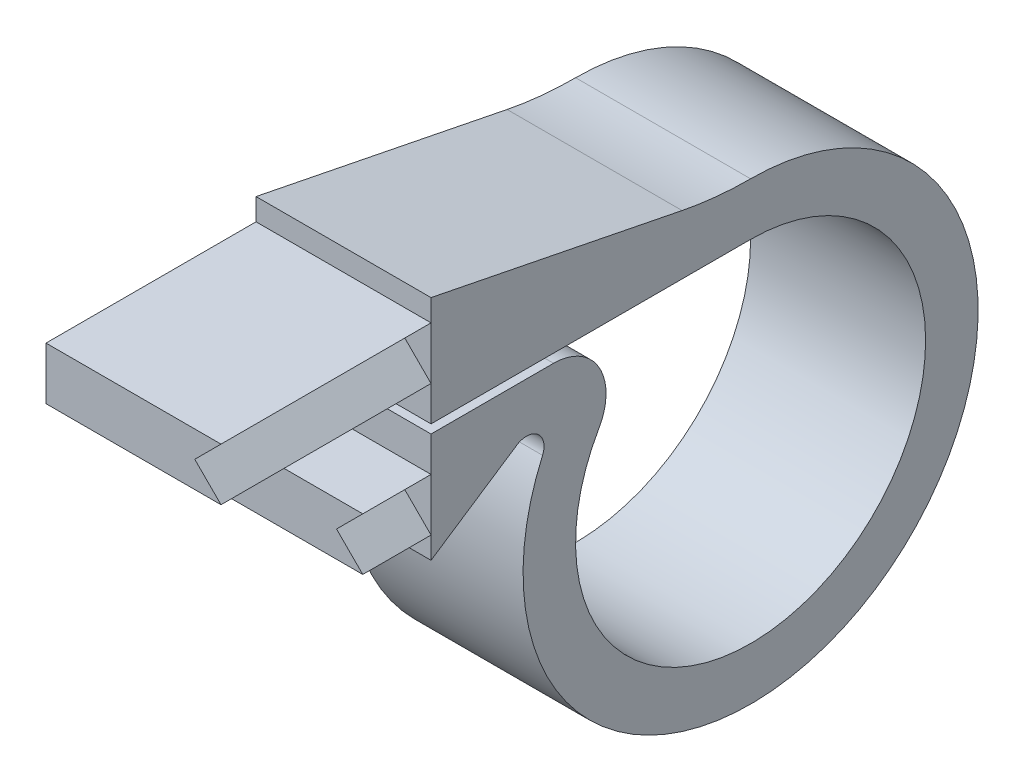
ISO-10303-21;
HEADER;
FILE_DESCRIPTION(('STEP AP214'),'2;1');
FILE_NAME('part.step','',(''),(''),'','','');
FILE_SCHEMA(('AUTOMOTIVE_DESIGN { 1 0 10303 214 1 1 1 1 }'));
ENDSEC;
DATA;
#1=APPLICATION_CONTEXT('core data for automotive mechanical design processes');
#2=APPLICATION_PROTOCOL_DEFINITION('international standard','automotive_design',2000,#1);
#3=PRODUCT_CONTEXT('',#1,'mechanical');
#4=PRODUCT('Part','Part','',(#3));
#5=PRODUCT_RELATED_PRODUCT_CATEGORY('part','',(#4));
#6=PRODUCT_DEFINITION_FORMATION('','',#4);
#7=PRODUCT_DEFINITION_CONTEXT('part definition',#1,'design');
#8=PRODUCT_DEFINITION('design','',#6,#7);
#9=PRODUCT_DEFINITION_SHAPE('','',#8);
#10=(LENGTH_UNIT() NAMED_UNIT(*) SI_UNIT(.MILLI.,.METRE.));
#11=(NAMED_UNIT(*) PLANE_ANGLE_UNIT() SI_UNIT($,.RADIAN.));
#12=(NAMED_UNIT(*) SI_UNIT($,.STERADIAN.) SOLID_ANGLE_UNIT());
#13=UNCERTAINTY_MEASURE_WITH_UNIT(LENGTH_MEASURE(1.E-05),#10,'distance_accuracy_value','');
#14=(GEOMETRIC_REPRESENTATION_CONTEXT(3) GLOBAL_UNCERTAINTY_ASSIGNED_CONTEXT((#13)) GLOBAL_UNIT_ASSIGNED_CONTEXT((#10,
#11,#12)) REPRESENTATION_CONTEXT('',''));
#15=CARTESIAN_POINT('',(0.,0.,0.));
#16=DIRECTION('',(0.,0.,1.));
#17=DIRECTION('',(1.,0.,0.));
#18=AXIS2_PLACEMENT_3D('',#15,#16,#17);
#19=CARTESIAN_POINT('',(0.,-10.,0.));
#20=DIRECTION('',(-1.,0.,0.));
#21=DIRECTION('',(0.,0.,1.));
#22=AXIS2_PLACEMENT_3D('',#19,#20,#21);
#23=PLANE('',#22);
#24=DIRECTION('',(0.,0.,-1.));
#25=VECTOR('',#24,1.);
#26=CARTESIAN_POINT('',(0.,-5.5,30.2583302491977));
#27=LINE('',#26,#25);
#28=CARTESIAN_POINT('',(0.,-5.5,22.1583302491977));
#29=VERTEX_POINT('',#28);
#30=CARTESIAN_POINT('',(0.,-5.5,18.2583302491977));
#31=VERTEX_POINT('',#30);
#32=EDGE_CURVE('E189',#29,#31,#27,.T.);
#33=ORIENTED_EDGE('',*,*,#32,.F.);
#34=DIRECTION('',(0.,1.,0.));
#35=VECTOR('',#34,1.);
#36=CARTESIAN_POINT('',(0.,0.,22.1583302491977));
#37=LINE('',#36,#35);
#38=CARTESIAN_POINT('',(0.,-2.5,22.1583302491977));
#39=VERTEX_POINT('',#38);
#40=EDGE_CURVE('E175',#29,#39,#37,.T.);
#41=ORIENTED_EDGE('',*,*,#40,.T.);
#42=DIRECTION('',(0.,0.,-1.));
#43=VECTOR('',#42,1.);
#44=CARTESIAN_POINT('',(0.,-2.5,30.2583302491977));
#45=LINE('',#44,#43);
#46=CARTESIAN_POINT('',(0.,-2.5,18.2583302491977));
#47=VERTEX_POINT('',#46);
#48=EDGE_CURVE('E328',#39,#47,#45,.T.);
#49=ORIENTED_EDGE('',*,*,#48,.T.);
#50=DIRECTION('',(0.,-1.,0.));
#51=VECTOR('',#50,1.);
#52=CARTESIAN_POINT('',(0.,-6.75,18.2583302491977));
#53=LINE('',#52,#51);
#54=CARTESIAN_POINT('',(0.,-0.5,18.2583302491977));
#55=VERTEX_POINT('',#54);
#56=EDGE_CURVE('E276',#55,#47,#53,.T.);
#57=ORIENTED_EDGE('',*,*,#56,.F.);
#58=DIRECTION('',(0.,0.,1.));
#59=VECTOR('',#58,1.);
#60=CARTESIAN_POINT('',(0.,-0.5,11.2583302491977));
#61=LINE('',#60,#59);
#62=CARTESIAN_POINT('',(0.,-0.5,11.2583302491977));
#63=VERTEX_POINT('',#62);
#64=EDGE_CURVE('E274',#63,#55,#61,.T.);
#65=ORIENTED_EDGE('',*,*,#64,.F.);
#66=CARTESIAN_POINT('',(0.,-3.5,11.2583302491977));
#67=DIRECTION('',(1.,0.,0.));
#68=DIRECTION('',(0.,0.,-1.));
#69=AXIS2_PLACEMENT_3D('',#66,#67,#68);
#70=CIRCLE('',#69,3.);
#71=CARTESIAN_POINT('',(0.,-5.,8.66025403784439));
#72=VERTEX_POINT('',#71);
#73=EDGE_CURVE('E272',#72,#63,#70,.T.);
#74=ORIENTED_EDGE('',*,*,#73,.F.);
#75=CARTESIAN_POINT('',(0.,-10.,0.));
#76=DIRECTION('',(-1.,0.,0.));
#77=DIRECTION('',(0.,0.,1.));
#78=AXIS2_PLACEMENT_3D('',#75,#76,#77);
#79=CIRCLE('',#78,10.);
#80=CARTESIAN_POINT('',(0.,0.,0.));
#81=VERTEX_POINT('',#80);
#82=EDGE_CURVE('E238',#81,#72,#79,.T.);
#83=ORIENTED_EDGE('',*,*,#82,.F.);
#84=DIRECTION('',(0.,0.,-1.));
#85=VECTOR('',#84,1.);
#86=CARTESIAN_POINT('',(0.,0.,0.));
#87=LINE('',#86,#85);
#88=CARTESIAN_POINT('',(0.,0.,18.2583302491977));
#89=VERTEX_POINT('',#88);
#90=EDGE_CURVE('E243',#89,#81,#87,.T.);
#91=ORIENTED_EDGE('',*,*,#90,.F.);
#92=DIRECTION('',(0.,-1.,0.));
#93=VECTOR('',#92,1.);
#94=CARTESIAN_POINT('',(0.,6.25,18.2583302491977));
#95=LINE('',#94,#93);
#96=CARTESIAN_POINT('',(0.,2.,18.2583302491977));
#97=VERTEX_POINT('',#96);
#98=EDGE_CURVE('E289',#97,#89,#95,.T.);
#99=ORIENTED_EDGE('',*,*,#98,.F.);
#100=DIRECTION('',(0.,0.,-1.));
#101=VECTOR('',#100,1.);
#102=CARTESIAN_POINT('',(0.,2.,30.2583302491977));
#103=LINE('',#102,#101);
#104=CARTESIAN_POINT('',(0.,2.,30.2583302491977));
#105=VERTEX_POINT('',#104);
#106=EDGE_CURVE('E235',#105,#97,#103,.T.);
#107=ORIENTED_EDGE('',*,*,#106,.F.);
#108=DIRECTION('',(0.,-1.,0.));
#109=VECTOR('',#108,1.);
#110=CARTESIAN_POINT('',(0.,5.,30.2583302491977));
#111=LINE('',#110,#109);
#112=CARTESIAN_POINT('',(0.,5.,30.2583302491977));
#113=VERTEX_POINT('',#112);
#114=EDGE_CURVE('E204',#113,#105,#111,.T.);
#115=ORIENTED_EDGE('',*,*,#114,.F.);
#116=DIRECTION('',(0.,0.,-1.));
#117=VECTOR('',#116,1.);
#118=CARTESIAN_POINT('',(0.,5.,30.2583302491977));
#119=LINE('',#118,#117);
#120=CARTESIAN_POINT('',(0.,5.,18.2583302491977));
#121=VERTEX_POINT('',#120);
#122=EDGE_CURVE('E215',#113,#121,#119,.T.);
#123=ORIENTED_EDGE('',*,*,#122,.T.);
#124=CARTESIAN_POINT('',(0.,6.25,18.2583302491977));
#125=VERTEX_POINT('',#124);
#126=EDGE_CURVE('E290',#125,#121,#95,.T.);
#127=ORIENTED_EDGE('',*,*,#126,.F.);
#128=DIRECTION('',(0.,0.195748670709465,0.980654096975828));
#129=VECTOR('',#128,1.);
#130=CARTESIAN_POINT('',(0.,3.38691806048344,3.91497341418931));
#131=LINE('',#130,#129);
#132=CARTESIAN_POINT('',(0.,3.38691806048344,3.91497341418931));
#133=VERTEX_POINT('',#132);
#134=EDGE_CURVE('E287',#133,#125,#131,.T.);
#135=ORIENTED_EDGE('',*,*,#134,.F.);
#136=CARTESIAN_POINT('',(0.,23.,0.));
#137=DIRECTION('',(-1.,0.,0.));
#138=DIRECTION('',(0.,0.,1.));
#139=AXIS2_PLACEMENT_3D('',#136,#137,#138);
#140=CIRCLE('',#139,20.);
#141=CARTESIAN_POINT('',(0.,3.,0.));
#142=VERTEX_POINT('',#141);
#143=EDGE_CURVE('E285',#142,#133,#140,.T.);
#144=ORIENTED_EDGE('',*,*,#143,.F.);
#145=CARTESIAN_POINT('',(0.,-10.,0.));
#146=DIRECTION('',(1.,0.,0.));
#147=DIRECTION('',(0.,0.,1.));
#148=AXIS2_PLACEMENT_3D('',#145,#146,#147);
#149=CIRCLE('',#148,13.);
#150=CARTESIAN_POINT('',(0.,-4.73830400663237,11.887579874532));
#151=VERTEX_POINT('',#150);
#152=EDGE_CURVE('E283',#151,#142,#149,.T.);
#153=ORIENTED_EDGE('',*,*,#152,.F.);
#154=CARTESIAN_POINT('',(0.,-4.33355816098871,12.8020090956499));
#155=DIRECTION('',(-1.,0.,0.));
#156=DIRECTION('',(0.,0.,-1.));
#157=AXIS2_PLACEMENT_3D('',#154,#155,#156);
#158=CIRCLE('',#157,0.999999999999999);
#159=CARTESIAN_POINT('',(0.,-3.5,13.3544408038719));
#160=VERTEX_POINT('',#159);
#161=EDGE_CURVE('E281',#160,#151,#158,.T.);
#162=ORIENTED_EDGE('',*,*,#161,.F.);
#163=DIRECTION('',(0.,0.552431708222033,-0.833558160988714));
#164=VECTOR('',#163,1.);
#165=CARTESIAN_POINT('',(0.,-6.75,18.2583302491977));
#166=LINE('',#165,#164);
#167=CARTESIAN_POINT('',(0.,-6.75,18.2583302491977));
#168=VERTEX_POINT('',#167);
#169=EDGE_CURVE('E279',#168,#160,#166,.T.);
#170=ORIENTED_EDGE('',*,*,#169,.F.);
#171=EDGE_CURVE('E194',#31,#168,#53,.T.);
#172=ORIENTED_EDGE('',*,*,#171,.F.);
#173=EDGE_LOOP('',(#33,#41,#49,#57,#65,#74,#83,#91,#99,#107,#115,#123,#127,#135,#144,#153,#162,
#170,#172));
#174=FACE_BOUND('',#173,.T.);
#175=ADVANCED_FACE('F33',(#174),#23,.T.);
#176=CARTESIAN_POINT('',(0.,-5.5,30.2583302491977));
#177=DIRECTION('',(0.,1.,0.));
#178=DIRECTION('',(-1.,0.,0.));
#179=AXIS2_PLACEMENT_3D('',#176,#177,#178);
#180=PLANE('',#179);
#181=DIRECTION('',(-1.,0.,0.));
#182=VECTOR('',#181,1.);
#183=CARTESIAN_POINT('',(12.,-5.5,22.1583302491977));
#184=LINE('',#183,#182);
#185=CARTESIAN_POINT('',(10.,-5.5,22.1583302491977));
#186=VERTEX_POINT('',#185);
#187=EDGE_CURVE('E178',#186,#29,#184,.T.);
#188=ORIENTED_EDGE('',*,*,#187,.T.);
#189=ORIENTED_EDGE('',*,*,#32,.T.);
#190=DIRECTION('',(1.,0.,0.));
#191=VECTOR('',#190,1.);
#192=CARTESIAN_POINT('',(0.,-5.5,18.2583302491977));
#193=LINE('',#192,#191);
#194=CARTESIAN_POINT('',(10.,-5.5,18.2583302491977));
#195=VERTEX_POINT('',#194);
#196=EDGE_CURVE('E349',#31,#195,#193,.T.);
#197=ORIENTED_EDGE('',*,*,#196,.T.);
#198=DIRECTION('',(0.,0.,-1.));
#199=VECTOR('',#198,1.);
#200=CARTESIAN_POINT('',(10.,-5.5,30.2583302491977));
#201=LINE('',#200,#199);
#202=EDGE_CURVE('E191',#186,#195,#201,.T.);
#203=ORIENTED_EDGE('',*,*,#202,.F.);
#204=EDGE_LOOP('',(#188,#189,#197,#203));
#205=FACE_BOUND('',#204,.T.);
#206=ADVANCED_FACE('F187',(#205),#180,.F.);
#207=CARTESIAN_POINT('',(8.5,-4.,30.2583302491977));
#208=DIRECTION('',(-0.707106781186548,-0.707106781186547,0.));
#209=DIRECTION('',(0.707106781186547,-0.707106781186548,0.));
#210=AXIS2_PLACEMENT_3D('',#207,#208,#209);
#211=PLANE('',#210);
#212=DIRECTION('',(-0.707106781186547,0.707106781186548,0.));
#213=VECTOR('',#212,1.);
#214=CARTESIAN_POINT('',(8.5,-4.,22.1583302491977));
#215=LINE('',#214,#213);
#216=CARTESIAN_POINT('',(8.5,-4.,22.1583302491977));
#217=VERTEX_POINT('',#216);
#218=EDGE_CURVE('E351',#186,#217,#215,.T.);
#219=ORIENTED_EDGE('',*,*,#218,.F.);
#220=ORIENTED_EDGE('',*,*,#202,.T.);
#221=DIRECTION('',(-0.707106781186547,0.707106781186548,0.));
#222=VECTOR('',#221,1.);
#223=CARTESIAN_POINT('',(8.5,-4.,18.2583302491977));
#224=LINE('',#223,#222);
#225=CARTESIAN_POINT('',(8.5,-4.,18.2583302491977));
#226=VERTEX_POINT('',#225);
#227=EDGE_CURVE('E343',#195,#226,#224,.T.);
#228=ORIENTED_EDGE('',*,*,#227,.T.);
#229=DIRECTION('',(0.,0.,-1.));
#230=VECTOR('',#229,1.);
#231=CARTESIAN_POINT('',(8.5,-4.,30.2583302491977));
#232=LINE('',#231,#230);
#233=EDGE_CURVE('E55',#217,#226,#232,.T.);
#234=ORIENTED_EDGE('',*,*,#233,.F.);
#235=EDGE_LOOP('',(#219,#220,#228,#234));
#236=FACE_BOUND('',#235,.T.);
#237=ADVANCED_FACE('F356',(#236),#211,.F.);
#238=CARTESIAN_POINT('',(10.,-2.5,30.2583302491977));
#239=DIRECTION('',(-0.707106781186548,0.707106781186547,0.));
#240=DIRECTION('',(-0.707106781186547,-0.707106781186548,0.));
#241=AXIS2_PLACEMENT_3D('',#238,#239,#240);
#242=PLANE('',#241);
#243=DIRECTION('',(0.707106781186547,0.707106781186548,0.));
#244=VECTOR('',#243,1.);
#245=CARTESIAN_POINT('',(10.,-2.5,22.1583302491977));
#246=LINE('',#245,#244);
#247=CARTESIAN_POINT('',(10.,-2.5,22.1583302491977));
#248=VERTEX_POINT('',#247);
#249=EDGE_CURVE('E48',#217,#248,#246,.T.);
#250=ORIENTED_EDGE('',*,*,#249,.F.);
#251=ORIENTED_EDGE('',*,*,#233,.T.);
#252=DIRECTION('',(0.707106781186547,0.707106781186548,0.));
#253=VECTOR('',#252,1.);
#254=CARTESIAN_POINT('',(10.,-2.5,18.2583302491977));
#255=LINE('',#254,#253);
#256=CARTESIAN_POINT('',(10.,-2.5,18.2583302491977));
#257=VERTEX_POINT('',#256);
#258=EDGE_CURVE('E340',#226,#257,#255,.T.);
#259=ORIENTED_EDGE('',*,*,#258,.T.);
#260=DIRECTION('',(0.,0.,-1.));
#261=VECTOR('',#260,1.);
#262=CARTESIAN_POINT('',(10.,-2.5,30.2583302491977));
#263=LINE('',#262,#261);
#264=EDGE_CURVE('E339',#248,#257,#263,.T.);
#265=ORIENTED_EDGE('',*,*,#264,.F.);
#266=EDGE_LOOP('',(#250,#251,#259,#265));
#267=FACE_BOUND('',#266,.T.);
#268=ADVANCED_FACE('F355',(#267),#242,.F.);
#269=CARTESIAN_POINT('',(10.,-2.5,30.2583302491977));
#270=DIRECTION('',(0.,-1.,0.));
#271=DIRECTION('',(0.,0.,-1.));
#272=AXIS2_PLACEMENT_3D('',#269,#270,#271);
#273=PLANE('',#272);
#274=DIRECTION('',(-1.,0.,0.));
#275=VECTOR('',#274,1.);
#276=CARTESIAN_POINT('',(12.,-2.5,22.1583302491977));
#277=LINE('',#276,#275);
#278=EDGE_CURVE('E180',#248,#39,#277,.T.);
#279=ORIENTED_EDGE('',*,*,#278,.F.);
#280=ORIENTED_EDGE('',*,*,#264,.T.);
#281=DIRECTION('',(-1.,0.,0.));
#282=VECTOR('',#281,1.);
#283=CARTESIAN_POINT('',(10.,-2.5,18.2583302491977));
#284=LINE('',#283,#282);
#285=EDGE_CURVE('E334',#257,#47,#284,.T.);
#286=ORIENTED_EDGE('',*,*,#285,.T.);
#287=ORIENTED_EDGE('',*,*,#48,.F.);
#288=EDGE_LOOP('',(#279,#280,#286,#287));
#289=FACE_BOUND('',#288,.T.);
#290=ADVANCED_FACE('F337',(#289),#273,.F.);
#291=CARTESIAN_POINT('',(10.,-6.75,18.2583302491977));
#292=DIRECTION('',(0.,0.,-1.));
#293=DIRECTION('',(-1.,0.,0.));
#294=AXIS2_PLACEMENT_3D('',#291,#292,#293);
#295=PLANE('',#294);
#296=ORIENTED_EDGE('',*,*,#196,.F.);
#297=ORIENTED_EDGE('',*,*,#171,.T.);
#298=DIRECTION('',(-1.,0.,0.));
#299=VECTOR('',#298,1.);
#300=CARTESIAN_POINT('',(10.,-6.75,18.2583302491977));
#301=LINE('',#300,#299);
#302=CARTESIAN_POINT('',(10.,-6.75,18.2583302491977));
#303=VERTEX_POINT('',#302);
#304=EDGE_CURVE('E313',#303,#168,#301,.T.);
#305=ORIENTED_EDGE('',*,*,#304,.F.);
#306=DIRECTION('',(0.,-1.,0.));
#307=VECTOR('',#306,1.);
#308=CARTESIAN_POINT('',(10.,-6.75,18.2583302491977));
#309=LINE('',#308,#307);
#310=EDGE_CURVE('E247',#195,#303,#309,.T.);
#311=ORIENTED_EDGE('',*,*,#310,.F.);
#312=EDGE_LOOP('',(#296,#297,#305,#311));
#313=FACE_BOUND('',#312,.T.);
#314=ADVANCED_FACE('F364',(#313),#295,.F.);
#315=ORIENTED_EDGE('',*,*,#227,.F.);
#316=EDGE_CURVE('E252',#257,#195,#309,.T.);
#317=ORIENTED_EDGE('',*,*,#316,.F.);
#318=ORIENTED_EDGE('',*,*,#258,.F.);
#319=EDGE_LOOP('',(#315,#317,#318));
#320=FACE_BOUND('',#319,.T.);
#321=ADVANCED_FACE('F360',(#320),#295,.F.);
#322=ORIENTED_EDGE('',*,*,#285,.F.);
#323=CARTESIAN_POINT('',(10.,-0.5,18.2583302491977));
#324=VERTEX_POINT('',#323);
#325=EDGE_CURVE('E248',#324,#257,#309,.T.);
#326=ORIENTED_EDGE('',*,*,#325,.F.);
#327=DIRECTION('',(-1.,0.,0.));
#328=VECTOR('',#327,1.);
#329=CARTESIAN_POINT('',(10.,-0.5,18.2583302491977));
#330=LINE('',#329,#328);
#331=EDGE_CURVE('E316',#324,#55,#330,.T.);
#332=ORIENTED_EDGE('',*,*,#331,.T.);
#333=ORIENTED_EDGE('',*,*,#56,.T.);
#334=EDGE_LOOP('',(#322,#326,#332,#333));
#335=FACE_BOUND('',#334,.T.);
#336=ADVANCED_FACE('F332',(#335),#295,.F.);
#337=CARTESIAN_POINT('',(10.,6.25,18.2583302491977));
#338=DIRECTION('',(0.,0.,-1.));
#339=DIRECTION('',(0.,1.,0.));
#340=AXIS2_PLACEMENT_3D('',#337,#338,#339);
#341=PLANE('',#340);
#342=DIRECTION('',(1.,0.,0.));
#343=VECTOR('',#342,1.);
#344=CARTESIAN_POINT('',(0.,2.,18.2583302491977));
#345=LINE('',#344,#343);
#346=CARTESIAN_POINT('',(10.,2.,18.2583302491977));
#347=VERTEX_POINT('',#346);
#348=EDGE_CURVE('E196',#97,#347,#345,.T.);
#349=ORIENTED_EDGE('',*,*,#348,.F.);
#350=ORIENTED_EDGE('',*,*,#98,.T.);
#351=DIRECTION('',(-1.,0.,0.));
#352=VECTOR('',#351,1.);
#353=CARTESIAN_POINT('',(10.,0.,18.2583302491977));
#354=LINE('',#353,#352);
#355=CARTESIAN_POINT('',(10.,0.,18.2583302491977));
#356=VERTEX_POINT('',#355);
#357=EDGE_CURVE('E295',#356,#89,#354,.T.);
#358=ORIENTED_EDGE('',*,*,#357,.F.);
#359=DIRECTION('',(0.,-1.,0.));
#360=VECTOR('',#359,1.);
#361=CARTESIAN_POINT('',(10.,6.25,18.2583302491977));
#362=LINE('',#361,#360);
#363=EDGE_CURVE('E262',#347,#356,#362,.T.);
#364=ORIENTED_EDGE('',*,*,#363,.F.);
#365=EDGE_LOOP('',(#349,#350,#358,#364));
#366=FACE_BOUND('',#365,.T.);
#367=ADVANCED_FACE('F382',(#366),#341,.F.);
#368=DIRECTION('',(-0.707106781186547,0.707106781186548,0.));
#369=VECTOR('',#368,1.);
#370=CARTESIAN_POINT('',(8.5,3.5,18.2583302491977));
#371=LINE('',#370,#369);
#372=CARTESIAN_POINT('',(8.5,3.5,18.2583302491977));
#373=VERTEX_POINT('',#372);
#374=EDGE_CURVE('E199',#347,#373,#371,.T.);
#375=ORIENTED_EDGE('',*,*,#374,.F.);
#376=CARTESIAN_POINT('',(10.,5.,18.2583302491977));
#377=VERTEX_POINT('',#376);
#378=EDGE_CURVE('E267',#377,#347,#362,.T.);
#379=ORIENTED_EDGE('',*,*,#378,.F.);
#380=DIRECTION('',(0.707106781186548,0.707106781186547,0.));
#381=VECTOR('',#380,1.);
#382=CARTESIAN_POINT('',(10.,5.,18.2583302491977));
#383=LINE('',#382,#381);
#384=EDGE_CURVE('E219',#373,#377,#383,.T.);
#385=ORIENTED_EDGE('',*,*,#384,.F.);
#386=EDGE_LOOP('',(#375,#379,#385));
#387=FACE_BOUND('',#386,.T.);
#388=ADVANCED_FACE('F402',(#387),#341,.F.);
#389=DIRECTION('',(-1.,0.,0.));
#390=VECTOR('',#389,1.);
#391=CARTESIAN_POINT('',(10.,5.,18.2583302491977));
#392=LINE('',#391,#390);
#393=EDGE_CURVE('E208',#377,#121,#392,.T.);
#394=ORIENTED_EDGE('',*,*,#393,.F.);
#395=CARTESIAN_POINT('',(10.,6.25,18.2583302491977));
#396=VERTEX_POINT('',#395);
#397=EDGE_CURVE('E263',#396,#377,#362,.T.);
#398=ORIENTED_EDGE('',*,*,#397,.F.);
#399=DIRECTION('',(-1.,0.,0.));
#400=VECTOR('',#399,1.);
#401=CARTESIAN_POINT('',(10.,6.25,18.2583302491977));
#402=LINE('',#401,#400);
#403=EDGE_CURVE('E298',#396,#125,#402,.T.);
#404=ORIENTED_EDGE('',*,*,#403,.T.);
#405=ORIENTED_EDGE('',*,*,#126,.T.);
#406=EDGE_LOOP('',(#394,#398,#404,#405));
#407=FACE_BOUND('',#406,.T.);
#408=ADVANCED_FACE('F400',(#407),#341,.F.);
#409=CARTESIAN_POINT('',(10.,-10.,0.));
#410=DIRECTION('',(-1.,0.,0.));
#411=DIRECTION('',(0.,0.,1.));
#412=AXIS2_PLACEMENT_3D('',#409,#410,#411);
#413=CYLINDRICAL_SURFACE('',#412,10.);
#414=ORIENTED_EDGE('',*,*,#82,.T.);
#415=DIRECTION('',(-1.,0.,0.));
#416=VECTOR('',#415,1.);
#417=CARTESIAN_POINT('',(10.,-5.,8.66025403784439));
#418=LINE('',#417,#416);
#419=CARTESIAN_POINT('',(10.,-5.,8.66025403784439));
#420=VERTEX_POINT('',#419);
#421=EDGE_CURVE('E11',#420,#72,#418,.T.);
#422=ORIENTED_EDGE('',*,*,#421,.F.);
#423=CARTESIAN_POINT('',(10.,-10.,0.));
#424=DIRECTION('',(-1.,0.,0.));
#425=DIRECTION('',(0.,0.,1.));
#426=AXIS2_PLACEMENT_3D('',#423,#424,#425);
#427=CIRCLE('',#426,10.);
#428=CARTESIAN_POINT('',(10.,0.,0.));
#429=VERTEX_POINT('',#428);
#430=EDGE_CURVE('E239',#429,#420,#427,.T.);
#431=ORIENTED_EDGE('',*,*,#430,.F.);
#432=DIRECTION('',(-1.,0.,0.));
#433=VECTOR('',#432,1.);
#434=CARTESIAN_POINT('',(10.,0.,0.));
#435=LINE('',#434,#433);
#436=EDGE_CURVE('E269',#429,#81,#435,.T.);
#437=ORIENTED_EDGE('',*,*,#436,.T.);
#438=EDGE_LOOP('',(#414,#422,#431,#437));
#439=FACE_BOUND('',#438,.T.);
#440=ADVANCED_FACE('F35',(#439),#413,.F.);
#441=CARTESIAN_POINT('',(10.,-3.5,11.2583302491977));
#442=DIRECTION('',(-1.,0.,0.));
#443=DIRECTION('',(0.,0.,1.));
#444=AXIS2_PLACEMENT_3D('',#441,#442,#443);
#445=CYLINDRICAL_SURFACE('',#444,3.);
#446=ORIENTED_EDGE('',*,*,#73,.T.);
#447=DIRECTION('',(-1.,0.,0.));
#448=VECTOR('',#447,1.);
#449=CARTESIAN_POINT('',(10.,-0.5,11.2583302491977));
#450=LINE('',#449,#448);
#451=CARTESIAN_POINT('',(10.,-0.5,11.2583302491977));
#452=VERTEX_POINT('',#451);
#453=EDGE_CURVE('E41',#452,#63,#450,.T.);
#454=ORIENTED_EDGE('',*,*,#453,.F.);
#455=CARTESIAN_POINT('',(10.,-3.5,11.2583302491977));
#456=DIRECTION('',(1.,0.,0.));
#457=DIRECTION('',(0.,0.,-1.));
#458=AXIS2_PLACEMENT_3D('',#455,#456,#457);
#459=CIRCLE('',#458,3.);
#460=EDGE_CURVE('E242',#420,#452,#459,.T.);
#461=ORIENTED_EDGE('',*,*,#460,.F.);
#462=ORIENTED_EDGE('',*,*,#421,.T.);
#463=EDGE_LOOP('',(#446,#454,#461,#462));
#464=FACE_BOUND('',#463,.T.);
#465=ADVANCED_FACE('F370',(#464),#445,.T.);
#466=CARTESIAN_POINT('',(10.,-0.5,11.2583302491977));
#467=DIRECTION('',(0.,-1.,0.));
#468=DIRECTION('',(0.,0.,-1.));
#469=AXIS2_PLACEMENT_3D('',#466,#467,#468);
#470=PLANE('',#469);
#471=ORIENTED_EDGE('',*,*,#64,.T.);
#472=ORIENTED_EDGE('',*,*,#331,.F.);
#473=DIRECTION('',(0.,0.,1.));
#474=VECTOR('',#473,1.);
#475=CARTESIAN_POINT('',(10.,-0.5,11.2583302491977));
#476=LINE('',#475,#474);
#477=EDGE_CURVE('E245',#452,#324,#476,.T.);
#478=ORIENTED_EDGE('',*,*,#477,.F.);
#479=ORIENTED_EDGE('',*,*,#453,.T.);
#480=EDGE_LOOP('',(#471,#472,#478,#479));
#481=FACE_BOUND('',#480,.T.);
#482=ADVANCED_FACE('F323',(#481),#470,.F.);
#483=CARTESIAN_POINT('',(10.,-6.75,18.2583302491977));
#484=DIRECTION('',(0.,0.833558160988714,0.552431708222033));
#485=DIRECTION('',(0.,-0.552431708222033,0.833558160988714));
#486=AXIS2_PLACEMENT_3D('',#483,#484,#485);
#487=PLANE('',#486);
#488=ORIENTED_EDGE('',*,*,#169,.T.);
#489=DIRECTION('',(-1.,0.,0.));
#490=VECTOR('',#489,1.);
#491=CARTESIAN_POINT('',(10.,-3.5,13.3544408038719));
#492=LINE('',#491,#490);
#493=CARTESIAN_POINT('',(10.,-3.5,13.3544408038719));
#494=VERTEX_POINT('',#493);
#495=EDGE_CURVE('E310',#494,#160,#492,.T.);
#496=ORIENTED_EDGE('',*,*,#495,.F.);
#497=DIRECTION('',(0.,0.552431708222033,-0.833558160988714));
#498=VECTOR('',#497,1.);
#499=CARTESIAN_POINT('',(10.,-6.75,18.2583302491977));
#500=LINE('',#499,#498);
#501=EDGE_CURVE('E251',#303,#494,#500,.T.);
#502=ORIENTED_EDGE('',*,*,#501,.F.);
#503=ORIENTED_EDGE('',*,*,#304,.T.);
#504=EDGE_LOOP('',(#488,#496,#502,#503));
#505=FACE_BOUND('',#504,.T.);
#506=ADVANCED_FACE('F446',(#505),#487,.F.);
#507=CARTESIAN_POINT('',(10.,-4.33355816098871,12.8020090956499));
#508=DIRECTION('',(-1.,0.,0.));
#509=DIRECTION('',(0.,0.,1.));
#510=AXIS2_PLACEMENT_3D('',#507,#508,#509);
#511=CYLINDRICAL_SURFACE('',#510,0.999999999999999);
#512=ORIENTED_EDGE('',*,*,#161,.T.);
#513=DIRECTION('',(-1.,0.,0.));
#514=VECTOR('',#513,1.);
#515=CARTESIAN_POINT('',(10.,-4.73830400663237,11.887579874532));
#516=LINE('',#515,#514);
#517=CARTESIAN_POINT('',(10.,-4.73830400663237,11.887579874532));
#518=VERTEX_POINT('',#517);
#519=EDGE_CURVE('E307',#518,#151,#516,.T.);
#520=ORIENTED_EDGE('',*,*,#519,.F.);
#521=CARTESIAN_POINT('',(10.,-4.33355816098871,12.8020090956499));
#522=DIRECTION('',(-1.,0.,0.));
#523=DIRECTION('',(0.,0.,-1.));
#524=AXIS2_PLACEMENT_3D('',#521,#522,#523);
#525=CIRCLE('',#524,0.999999999999999);
#526=EDGE_CURVE('E254',#494,#518,#525,.T.);
#527=ORIENTED_EDGE('',*,*,#526,.F.);
#528=ORIENTED_EDGE('',*,*,#495,.T.);
#529=EDGE_LOOP('',(#512,#520,#527,#528));
#530=FACE_BOUND('',#529,.T.);
#531=ADVANCED_FACE('F442',(#530),#511,.F.);
#532=CARTESIAN_POINT('',(10.,-10.,0.));
#533=DIRECTION('',(-1.,0.,0.));
#534=DIRECTION('',(0.,0.,1.));
#535=AXIS2_PLACEMENT_3D('',#532,#533,#534);
#536=CYLINDRICAL_SURFACE('',#535,13.);
#537=ORIENTED_EDGE('',*,*,#152,.T.);
#538=DIRECTION('',(-1.,0.,0.));
#539=VECTOR('',#538,1.);
#540=CARTESIAN_POINT('',(10.,3.,0.));
#541=LINE('',#540,#539);
#542=CARTESIAN_POINT('',(10.,3.,0.));
#543=VERTEX_POINT('',#542);
#544=EDGE_CURVE('E304',#543,#142,#541,.T.);
#545=ORIENTED_EDGE('',*,*,#544,.F.);
#546=CARTESIAN_POINT('',(10.,-10.,0.));
#547=DIRECTION('',(1.,0.,0.));
#548=DIRECTION('',(0.,0.,1.));
#549=AXIS2_PLACEMENT_3D('',#546,#547,#548);
#550=CIRCLE('',#549,13.);
#551=EDGE_CURVE('E256',#518,#543,#550,.T.);
#552=ORIENTED_EDGE('',*,*,#551,.F.);
#553=ORIENTED_EDGE('',*,*,#519,.T.);
#554=EDGE_LOOP('',(#537,#545,#552,#553));
#555=FACE_BOUND('',#554,.T.);
#556=ADVANCED_FACE('F438',(#555),#536,.T.);
#557=CARTESIAN_POINT('',(10.,23.,0.));
#558=DIRECTION('',(-1.,0.,0.));
#559=DIRECTION('',(0.,0.,1.));
#560=AXIS2_PLACEMENT_3D('',#557,#558,#559);
#561=CYLINDRICAL_SURFACE('',#560,20.);
#562=ORIENTED_EDGE('',*,*,#143,.T.);
#563=DIRECTION('',(-1.,0.,0.));
#564=VECTOR('',#563,1.);
#565=CARTESIAN_POINT('',(10.,3.38691806048344,3.91497341418931));
#566=LINE('',#565,#564);
#567=CARTESIAN_POINT('',(10.,3.38691806048344,3.91497341418931));
#568=VERTEX_POINT('',#567);
#569=EDGE_CURVE('E301',#568,#133,#566,.T.);
#570=ORIENTED_EDGE('',*,*,#569,.F.);
#571=CARTESIAN_POINT('',(10.,23.,0.));
#572=DIRECTION('',(-1.,0.,0.));
#573=DIRECTION('',(0.,0.,1.));
#574=AXIS2_PLACEMENT_3D('',#571,#572,#573);
#575=CIRCLE('',#574,20.);
#576=EDGE_CURVE('E258',#543,#568,#575,.T.);
#577=ORIENTED_EDGE('',*,*,#576,.F.);
#578=ORIENTED_EDGE('',*,*,#544,.T.);
#579=EDGE_LOOP('',(#562,#570,#577,#578));
#580=FACE_BOUND('',#579,.T.);
#581=ADVANCED_FACE('F434',(#580),#561,.F.);
#582=CARTESIAN_POINT('',(10.,3.38691806048344,3.91497341418931));
#583=DIRECTION('',(0.,-0.980654096975828,0.195748670709465));
#584=DIRECTION('',(0.,-0.195748670709465,-0.980654096975828));
#585=AXIS2_PLACEMENT_3D('',#582,#583,#584);
#586=PLANE('',#585);
#587=ORIENTED_EDGE('',*,*,#134,.T.);
#588=ORIENTED_EDGE('',*,*,#403,.F.);
#589=DIRECTION('',(0.,0.195748670709465,0.980654096975828));
#590=VECTOR('',#589,1.);
#591=CARTESIAN_POINT('',(10.,3.38691806048344,3.91497341418931));
#592=LINE('',#591,#590);
#593=EDGE_CURVE('E260',#568,#396,#592,.T.);
#594=ORIENTED_EDGE('',*,*,#593,.F.);
#595=ORIENTED_EDGE('',*,*,#569,.T.);
#596=EDGE_LOOP('',(#587,#588,#594,#595));
#597=FACE_BOUND('',#596,.T.);
#598=ADVANCED_FACE('F429',(#597),#586,.F.);
#599=CARTESIAN_POINT('',(10.,0.,0.));
#600=DIRECTION('',(0.,1.,0.));
#601=DIRECTION('',(0.,0.,1.));
#602=AXIS2_PLACEMENT_3D('',#599,#600,#601);
#603=PLANE('',#602);
#604=ORIENTED_EDGE('',*,*,#90,.T.);
#605=ORIENTED_EDGE('',*,*,#436,.F.);
#606=DIRECTION('',(0.,0.,-1.));
#607=VECTOR('',#606,1.);
#608=CARTESIAN_POINT('',(10.,0.,0.));
#609=LINE('',#608,#607);
#610=EDGE_CURVE('E266',#356,#429,#609,.T.);
#611=ORIENTED_EDGE('',*,*,#610,.F.);
#612=ORIENTED_EDGE('',*,*,#357,.T.);
#613=EDGE_LOOP('',(#604,#605,#611,#612));
#614=FACE_BOUND('',#613,.T.);
#615=ADVANCED_FACE('F377',(#614),#603,.F.);
#616=CARTESIAN_POINT('',(10.,-10.,0.));
#617=DIRECTION('',(-1.,0.,0.));
#618=DIRECTION('',(0.,0.,1.));
#619=AXIS2_PLACEMENT_3D('',#616,#617,#618);
#620=PLANE('',#619);
#621=ORIENTED_EDGE('',*,*,#430,.T.);
#622=ORIENTED_EDGE('',*,*,#460,.T.);
#623=ORIENTED_EDGE('',*,*,#477,.T.);
#624=ORIENTED_EDGE('',*,*,#325,.T.);
#625=ORIENTED_EDGE('',*,*,#316,.T.);
#626=ORIENTED_EDGE('',*,*,#310,.T.);
#627=ORIENTED_EDGE('',*,*,#501,.T.);
#628=ORIENTED_EDGE('',*,*,#526,.T.);
#629=ORIENTED_EDGE('',*,*,#551,.T.);
#630=ORIENTED_EDGE('',*,*,#576,.T.);
#631=ORIENTED_EDGE('',*,*,#593,.T.);
#632=ORIENTED_EDGE('',*,*,#397,.T.);
#633=ORIENTED_EDGE('',*,*,#378,.T.);
#634=ORIENTED_EDGE('',*,*,#363,.T.);
#635=ORIENTED_EDGE('',*,*,#610,.T.);
#636=EDGE_LOOP('',(#621,#622,#623,#624,#625,#626,#627,#628,#629,#630,#631,#632,#633,#634,#635));
#637=FACE_BOUND('',#636,.T.);
#638=ADVANCED_FACE('F367',(#637),#620,.F.);
#639=CARTESIAN_POINT('',(0.,2.,30.2583302491977));
#640=DIRECTION('',(0.,1.,0.));
#641=DIRECTION('',(-1.,0.,0.));
#642=AXIS2_PLACEMENT_3D('',#639,#640,#641);
#643=PLANE('',#642);
#644=ORIENTED_EDGE('',*,*,#348,.T.);
#645=DIRECTION('',(0.,0.,-1.));
#646=VECTOR('',#645,1.);
#647=CARTESIAN_POINT('',(10.,2.,30.2583302491977));
#648=LINE('',#647,#646);
#649=CARTESIAN_POINT('',(10.,2.,30.2583302491977));
#650=VERTEX_POINT('',#649);
#651=EDGE_CURVE('E232',#650,#347,#648,.T.);
#652=ORIENTED_EDGE('',*,*,#651,.F.);
#653=DIRECTION('',(1.,0.,0.));
#654=VECTOR('',#653,1.);
#655=CARTESIAN_POINT('',(0.,2.,30.2583302491977));
#656=LINE('',#655,#654);
#657=EDGE_CURVE('E207',#105,#650,#656,.T.);
#658=ORIENTED_EDGE('',*,*,#657,.F.);
#659=ORIENTED_EDGE('',*,*,#106,.T.);
#660=EDGE_LOOP('',(#644,#652,#658,#659));
#661=FACE_BOUND('',#660,.T.);
#662=ADVANCED_FACE('F386',(#661),#643,.F.);
#663=CARTESIAN_POINT('',(8.5,3.5,30.2583302491977));
#664=DIRECTION('',(-0.707106781186548,-0.707106781186547,0.));
#665=DIRECTION('',(0.707106781186547,-0.707106781186548,0.));
#666=AXIS2_PLACEMENT_3D('',#663,#664,#665);
#667=PLANE('',#666);
#668=ORIENTED_EDGE('',*,*,#374,.T.);
#669=DIRECTION('',(0.,0.,-1.));
#670=VECTOR('',#669,1.);
#671=CARTESIAN_POINT('',(8.5,3.5,30.2583302491977));
#672=LINE('',#671,#670);
#673=CARTESIAN_POINT('',(8.5,3.5,30.2583302491977));
#674=VERTEX_POINT('',#673);
#675=EDGE_CURVE('E229',#674,#373,#672,.T.);
#676=ORIENTED_EDGE('',*,*,#675,.F.);
#677=DIRECTION('',(-0.707106781186547,0.707106781186548,0.));
#678=VECTOR('',#677,1.);
#679=CARTESIAN_POINT('',(8.5,3.5,30.2583302491977));
#680=LINE('',#679,#678);
#681=EDGE_CURVE('E210',#650,#674,#680,.T.);
#682=ORIENTED_EDGE('',*,*,#681,.F.);
#683=ORIENTED_EDGE('',*,*,#651,.T.);
#684=EDGE_LOOP('',(#668,#676,#682,#683));
#685=FACE_BOUND('',#684,.T.);
#686=ADVANCED_FACE('F410',(#685),#667,.F.);
#687=CARTESIAN_POINT('',(10.,5.,30.2583302491977));
#688=DIRECTION('',(-0.707106781186547,0.707106781186548,0.));
#689=DIRECTION('',(-0.707106781186548,-0.707106781186547,0.));
#690=AXIS2_PLACEMENT_3D('',#687,#688,#689);
#691=PLANE('',#690);
#692=ORIENTED_EDGE('',*,*,#384,.T.);
#693=DIRECTION('',(0.,0.,-1.));
#694=VECTOR('',#693,1.);
#695=CARTESIAN_POINT('',(10.,5.,30.2583302491977));
#696=LINE('',#695,#694);
#697=CARTESIAN_POINT('',(10.,5.,30.2583302491977));
#698=VERTEX_POINT('',#697);
#699=EDGE_CURVE('E226',#698,#377,#696,.T.);
#700=ORIENTED_EDGE('',*,*,#699,.F.);
#701=DIRECTION('',(0.707106781186548,0.707106781186547,0.));
#702=VECTOR('',#701,1.);
#703=CARTESIAN_POINT('',(10.,5.,30.2583302491977));
#704=LINE('',#703,#702);
#705=EDGE_CURVE('E212',#674,#698,#704,.T.);
#706=ORIENTED_EDGE('',*,*,#705,.F.);
#707=ORIENTED_EDGE('',*,*,#675,.T.);
#708=EDGE_LOOP('',(#692,#700,#706,#707));
#709=FACE_BOUND('',#708,.T.);
#710=ADVANCED_FACE('F406',(#709),#691,.F.);
#711=CARTESIAN_POINT('',(10.,5.,30.2583302491977));
#712=DIRECTION('',(0.,-1.,0.));
#713=DIRECTION('',(1.,0.,0.));
#714=AXIS2_PLACEMENT_3D('',#711,#712,#713);
#715=PLANE('',#714);
#716=ORIENTED_EDGE('',*,*,#393,.T.);
#717=ORIENTED_EDGE('',*,*,#122,.F.);
#718=DIRECTION('',(-1.,0.,0.));
#719=VECTOR('',#718,1.);
#720=CARTESIAN_POINT('',(10.,5.,30.2583302491977));
#721=LINE('',#720,#719);
#722=EDGE_CURVE('E214',#698,#113,#721,.T.);
#723=ORIENTED_EDGE('',*,*,#722,.F.);
#724=ORIENTED_EDGE('',*,*,#699,.T.);
#725=EDGE_LOOP('',(#716,#717,#723,#724));
#726=FACE_BOUND('',#725,.T.);
#727=ADVANCED_FACE('F396',(#726),#715,.F.);
#728=CARTESIAN_POINT('',(0.,0.,30.2583302491977));
#729=DIRECTION('',(0.,0.,1.));
#730=DIRECTION('',(1.,0.,0.));
#731=AXIS2_PLACEMENT_3D('',#728,#729,#730);
#732=PLANE('',#731);
#733=ORIENTED_EDGE('',*,*,#114,.T.);
#734=ORIENTED_EDGE('',*,*,#657,.T.);
#735=ORIENTED_EDGE('',*,*,#681,.T.);
#736=ORIENTED_EDGE('',*,*,#705,.T.);
#737=ORIENTED_EDGE('',*,*,#722,.T.);
#738=EDGE_LOOP('',(#733,#734,#735,#736,#737));
#739=FACE_BOUND('',#738,.T.);
#740=ADVANCED_FACE('F391',(#739),#732,.T.);
#741=CARTESIAN_POINT('',(12.,0.,22.1583302491977));
#742=DIRECTION('',(0.,0.,1.));
#743=DIRECTION('',(1.,0.,0.));
#744=AXIS2_PLACEMENT_3D('',#741,#742,#743);
#745=PLANE('',#744);
#746=ORIENTED_EDGE('',*,*,#218,.T.);
#747=ORIENTED_EDGE('',*,*,#249,.T.);
#748=ORIENTED_EDGE('',*,*,#278,.T.);
#749=ORIENTED_EDGE('',*,*,#40,.F.);
#750=ORIENTED_EDGE('',*,*,#187,.F.);
#751=EDGE_LOOP('',(#746,#747,#748,#749,#750));
#752=FACE_BOUND('',#751,.T.);
#753=ADVANCED_FACE('F177',(#752),#745,.T.);
#754=CLOSED_SHELL('',(#175,#206,#237,#268,#290,#314,#321,#336,#367,#388,#408,#440,#465,#482,
#506,#531,#556,#581,#598,#615,#638,#662,#686,#710,#727,#740,#753));
#755=MANIFOLD_SOLID_BREP('B2',#754);
#756=ADVANCED_BREP_SHAPE_REPRESENTATION('',(#18,#755),#14);
#757=SHAPE_DEFINITION_REPRESENTATION(#9,#756);
ENDSEC;
END-ISO-10303-21;
